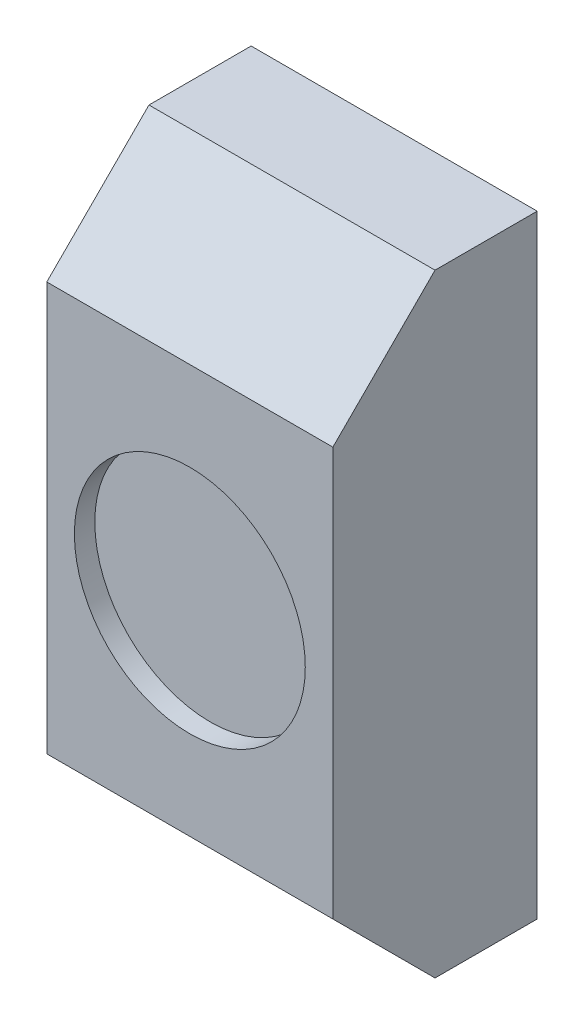
ISO-10303-21;
HEADER;
FILE_DESCRIPTION(('STEP AP214'),'2;1');
FILE_NAME('part.step','',(''),(''),'','','');
FILE_SCHEMA(('AUTOMOTIVE_DESIGN { 1 0 10303 214 1 1 1 1 }'));
ENDSEC;
DATA;
#1=APPLICATION_CONTEXT('core data for automotive mechanical design processes');
#2=APPLICATION_PROTOCOL_DEFINITION('international standard','automotive_design',2000,#1);
#3=PRODUCT_CONTEXT('',#1,'mechanical');
#4=PRODUCT('Part','Part','',(#3));
#5=PRODUCT_RELATED_PRODUCT_CATEGORY('part','',(#4));
#6=PRODUCT_DEFINITION_FORMATION('','',#4);
#7=PRODUCT_DEFINITION_CONTEXT('part definition',#1,'design');
#8=PRODUCT_DEFINITION('design','',#6,#7);
#9=PRODUCT_DEFINITION_SHAPE('','',#8);
#10=(LENGTH_UNIT() NAMED_UNIT(*) SI_UNIT(.MILLI.,.METRE.));
#11=(NAMED_UNIT(*) PLANE_ANGLE_UNIT() SI_UNIT($,.RADIAN.));
#12=(NAMED_UNIT(*) SI_UNIT($,.STERADIAN.) SOLID_ANGLE_UNIT());
#13=UNCERTAINTY_MEASURE_WITH_UNIT(LENGTH_MEASURE(1.E-05),#10,'distance_accuracy_value','');
#14=(GEOMETRIC_REPRESENTATION_CONTEXT(3) GLOBAL_UNCERTAINTY_ASSIGNED_CONTEXT((#13)) GLOBAL_UNIT_ASSIGNED_CONTEXT((#10,
#11,#12)) REPRESENTATION_CONTEXT('',''));
#15=CARTESIAN_POINT('',(0.,0.,0.));
#16=DIRECTION('',(0.,0.,1.));
#17=DIRECTION('',(1.,0.,0.));
#18=AXIS2_PLACEMENT_3D('',#15,#16,#17);
#19=CARTESIAN_POINT('',(-40.1365560583595,40.2646950029348,171.5));
#20=DIRECTION('',(1.,0.,0.));
#21=DIRECTION('',(0.,1.,0.));
#22=AXIS2_PLACEMENT_3D('',#19,#20,#21);
#23=PLANE('',#22);
#24=DIRECTION('',(0.,1.,0.));
#25=VECTOR('',#24,1.);
#26=CARTESIAN_POINT('',(-40.1365560583595,0.,169.5));
#27=LINE('',#26,#25);
#28=CARTESIAN_POINT('',(-40.1365560583595,16.093122127681,169.5));
#29=VERTEX_POINT('',#28);
#30=CARTESIAN_POINT('',(-40.1365560583595,34.4362678781886,169.5));
#31=VERTEX_POINT('',#30);
#32=EDGE_CURVE('E216',#29,#31,#27,.T.);
#33=ORIENTED_EDGE('',*,*,#32,.F.);
#34=DIRECTION('',(0.,0.707106781186547,0.707106781186548));
#35=VECTOR('',#34,1.);
#36=CARTESIAN_POINT('',(-40.1365560583595,-76.7034389361595,76.7034389361593));
#37=LINE('',#36,#35);
#38=CARTESIAN_POINT('',(-40.1365560583595,12.2646950029348,165.671572875254));
#39=VERTEX_POINT('',#38);
#40=EDGE_CURVE('E61',#39,#29,#37,.T.);
#41=ORIENTED_EDGE('',*,*,#40,.F.);
#42=DIRECTION('',(0.,0.,1.));
#43=VECTOR('',#42,1.);
#44=CARTESIAN_POINT('',(-40.1365560583595,12.2646950029348,0.));
#45=LINE('',#44,#43);
#46=CARTESIAN_POINT('',(-40.1365560583595,12.2646950029348,163.5));
#47=VERTEX_POINT('',#46);
#48=EDGE_CURVE('E199',#47,#39,#45,.T.);
#49=ORIENTED_EDGE('',*,*,#48,.F.);
#50=DIRECTION('',(0.,-1.,0.));
#51=VECTOR('',#50,1.);
#52=CARTESIAN_POINT('',(-40.1365560583595,0.,163.5));
#53=LINE('',#52,#51);
#54=CARTESIAN_POINT('',(-40.1365560583595,38.2646950029348,163.5));
#55=VERTEX_POINT('',#54);
#56=EDGE_CURVE('E225',#55,#47,#53,.T.);
#57=ORIENTED_EDGE('',*,*,#56,.F.);
#58=DIRECTION('',(0.,0.,-1.));
#59=VECTOR('',#58,1.);
#60=CARTESIAN_POINT('',(-40.1365560583595,38.2646950029348,0.));
#61=LINE('',#60,#59);
#62=CARTESIAN_POINT('',(-40.1365560583595,38.2646950029348,165.671572875254));
#63=VERTEX_POINT('',#62);
#64=EDGE_CURVE('E222',#63,#55,#61,.T.);
#65=ORIENTED_EDGE('',*,*,#64,.F.);
#66=DIRECTION('',(0.,0.707106781186544,-0.707106781186551));
#67=VECTOR('',#66,1.);
#68=CARTESIAN_POINT('',(-40.1365560583596,101.968133939094,101.968133939094));
#69=LINE('',#68,#67);
#70=EDGE_CURVE('E219',#31,#63,#69,.T.);
#71=ORIENTED_EDGE('',*,*,#70,.F.);
#72=EDGE_LOOP('',(#33,#41,#49,#57,#65,#71));
#73=FACE_BOUND('',#72,.T.);
#74=DIRECTION('',(0.,-1.,0.));
#75=VECTOR('',#74,1.);
#76=CARTESIAN_POINT('',(-40.1365560583595,40.2646950029348,171.5));
#77=LINE('',#76,#75);
#78=CARTESIAN_POINT('',(-40.1365560583595,35.2646950029348,171.5));
#79=VERTEX_POINT('',#78);
#80=CARTESIAN_POINT('',(-40.1365560583595,15.2646950029348,171.5));
#81=VERTEX_POINT('',#80);
#82=EDGE_CURVE('E242',#79,#81,#77,.T.);
#83=ORIENTED_EDGE('',*,*,#82,.F.);
#84=DIRECTION('',(0.,0.707106781186545,-0.70710678118655));
#85=VECTOR('',#84,1.);
#86=CARTESIAN_POINT('',(-40.1365560583595,35.2646950029348,171.5));
#87=LINE('',#86,#85);
#88=CARTESIAN_POINT('',(-40.1365560583595,40.2646950029348,166.5));
#89=VERTEX_POINT('',#88);
#90=EDGE_CURVE('E278',#79,#89,#87,.T.);
#91=ORIENTED_EDGE('',*,*,#90,.T.);
#92=DIRECTION('',(0.,0.,-1.));
#93=VECTOR('',#92,1.);
#94=CARTESIAN_POINT('',(-40.1365560583595,40.2646950029348,171.5));
#95=LINE('',#94,#93);
#96=CARTESIAN_POINT('',(-40.1365560583595,40.2646950029348,161.5));
#97=VERTEX_POINT('',#96);
#98=EDGE_CURVE('E247',#89,#97,#95,.T.);
#99=ORIENTED_EDGE('',*,*,#98,.T.);
#100=DIRECTION('',(0.,-1.,0.));
#101=VECTOR('',#100,1.);
#102=CARTESIAN_POINT('',(-40.1365560583595,40.2646950029348,161.5));
#103=LINE('',#102,#101);
#104=CARTESIAN_POINT('',(-40.1365560583595,10.2646950029348,161.5));
#105=VERTEX_POINT('',#104);
#106=EDGE_CURVE('E232',#97,#105,#103,.T.);
#107=ORIENTED_EDGE('',*,*,#106,.T.);
#108=DIRECTION('',(0.,0.,-1.));
#109=VECTOR('',#108,1.);
#110=CARTESIAN_POINT('',(-40.1365560583595,10.2646950029348,171.5));
#111=LINE('',#110,#109);
#112=CARTESIAN_POINT('',(-40.1365560583595,10.2646950029348,166.5));
#113=VERTEX_POINT('',#112);
#114=EDGE_CURVE('E263',#113,#105,#111,.T.);
#115=ORIENTED_EDGE('',*,*,#114,.F.);
#116=DIRECTION('',(0.,0.707106781186546,0.707106781186549));
#117=VECTOR('',#116,1.);
#118=CARTESIAN_POINT('',(-40.1365560583595,15.2646950029348,171.5));
#119=LINE('',#118,#117);
#120=EDGE_CURVE('E272',#113,#81,#119,.T.);
#121=ORIENTED_EDGE('',*,*,#120,.T.);
#122=EDGE_LOOP('',(#83,#91,#99,#107,#115,#121));
#123=FACE_BOUND('',#122,.T.);
#124=ADVANCED_FACE('F37',(#73,#123),#23,.F.);
#125=CARTESIAN_POINT('',(-40.1365560583595,10.2646950029348,171.5));
#126=DIRECTION('',(0.,1.,0.));
#127=DIRECTION('',(0.,0.,1.));
#128=AXIS2_PLACEMENT_3D('',#125,#126,#127);
#129=PLANE('',#128);
#130=DIRECTION('',(0.,0.,-1.));
#131=VECTOR('',#130,1.);
#132=CARTESIAN_POINT('',(-26.1365560583595,10.2646950029348,171.5));
#133=LINE('',#132,#131);
#134=CARTESIAN_POINT('',(-26.1365560583595,10.2646950029348,166.5));
#135=VERTEX_POINT('',#134);
#136=CARTESIAN_POINT('',(-26.1365560583595,10.2646950029348,161.5));
#137=VERTEX_POINT('',#136);
#138=EDGE_CURVE('E261',#135,#137,#133,.T.);
#139=ORIENTED_EDGE('',*,*,#138,.F.);
#140=DIRECTION('',(-1.,0.,0.));
#141=VECTOR('',#140,1.);
#142=CARTESIAN_POINT('',(-40.1365560583595,10.2646950029348,166.5));
#143=LINE('',#142,#141);
#144=EDGE_CURVE('E270',#135,#113,#143,.T.);
#145=ORIENTED_EDGE('',*,*,#144,.T.);
#146=ORIENTED_EDGE('',*,*,#114,.T.);
#147=DIRECTION('',(1.,0.,0.));
#148=VECTOR('',#147,1.);
#149=CARTESIAN_POINT('',(-40.1365560583595,10.2646950029348,161.5));
#150=LINE('',#149,#148);
#151=EDGE_CURVE('E250',#105,#137,#150,.T.);
#152=ORIENTED_EDGE('',*,*,#151,.T.);
#153=EDGE_LOOP('',(#139,#145,#146,#152));
#154=FACE_BOUND('',#153,.T.);
#155=ADVANCED_FACE('F305',(#154),#129,.F.);
#156=CARTESIAN_POINT('',(-26.1365560583595,40.2646950029348,171.5));
#157=DIRECTION('',(-1.,0.,0.));
#158=DIRECTION('',(0.,0.,1.));
#159=AXIS2_PLACEMENT_3D('',#156,#157,#158);
#160=PLANE('',#159);
#161=DIRECTION('',(0.,-0.707106781186545,0.70710678118655));
#162=VECTOR('',#161,1.);
#163=CARTESIAN_POINT('',(-26.1365560583595,35.2646950029348,171.5));
#164=LINE('',#163,#162);
#165=CARTESIAN_POINT('',(-26.1365560583595,40.2646950029348,166.5));
#166=VERTEX_POINT('',#165);
#167=CARTESIAN_POINT('',(-26.1365560583595,35.2646950029348,171.5));
#168=VERTEX_POINT('',#167);
#169=EDGE_CURVE('E11',#166,#168,#164,.T.);
#170=ORIENTED_EDGE('',*,*,#169,.T.);
#171=DIRECTION('',(0.,1.,0.));
#172=VECTOR('',#171,1.);
#173=CARTESIAN_POINT('',(-26.1365560583595,22.7564500006389,171.5));
#174=LINE('',#173,#172);
#175=CARTESIAN_POINT('',(-26.1365560583595,15.2646950029348,171.5));
#176=VERTEX_POINT('',#175);
#177=EDGE_CURVE('E244',#176,#168,#174,.T.);
#178=ORIENTED_EDGE('',*,*,#177,.F.);
#179=DIRECTION('',(0.,-0.707106781186546,-0.707106781186549));
#180=VECTOR('',#179,1.);
#181=CARTESIAN_POINT('',(-26.1365560583595,15.2646950029348,171.5));
#182=LINE('',#181,#180);
#183=EDGE_CURVE('E268',#176,#135,#182,.T.);
#184=ORIENTED_EDGE('',*,*,#183,.T.);
#185=ORIENTED_EDGE('',*,*,#138,.T.);
#186=DIRECTION('',(0.,1.,0.));
#187=VECTOR('',#186,1.);
#188=CARTESIAN_POINT('',(-26.1365560583595,40.2646950029348,161.5));
#189=LINE('',#188,#187);
#190=CARTESIAN_POINT('',(-26.1365560583595,40.2646950029348,161.5));
#191=VERTEX_POINT('',#190);
#192=EDGE_CURVE('E253',#137,#191,#189,.T.);
#193=ORIENTED_EDGE('',*,*,#192,.T.);
#194=DIRECTION('',(0.,0.,-1.));
#195=VECTOR('',#194,1.);
#196=CARTESIAN_POINT('',(-26.1365560583595,40.2646950029348,171.5));
#197=LINE('',#196,#195);
#198=EDGE_CURVE('E259',#166,#191,#197,.T.);
#199=ORIENTED_EDGE('',*,*,#198,.F.);
#200=EDGE_LOOP('',(#170,#178,#184,#185,#193,#199));
#201=FACE_BOUND('',#200,.T.);
#202=ADVANCED_FACE('F287',(#201),#160,.F.);
#203=CARTESIAN_POINT('',(-40.1365560583595,40.2646950029348,171.5));
#204=DIRECTION('',(0.,-1.,0.));
#205=DIRECTION('',(1.,0.,0.));
#206=AXIS2_PLACEMENT_3D('',#203,#204,#205);
#207=PLANE('',#206);
#208=ORIENTED_EDGE('',*,*,#98,.F.);
#209=DIRECTION('',(1.,0.,0.));
#210=VECTOR('',#209,1.);
#211=CARTESIAN_POINT('',(-26.1365560583595,40.2646950029348,166.5));
#212=LINE('',#211,#210);
#213=EDGE_CURVE('E46',#89,#166,#212,.T.);
#214=ORIENTED_EDGE('',*,*,#213,.T.);
#215=ORIENTED_EDGE('',*,*,#198,.T.);
#216=DIRECTION('',(-1.,0.,0.));
#217=VECTOR('',#216,1.);
#218=CARTESIAN_POINT('',(-40.1365560583595,40.2646950029348,161.5));
#219=LINE('',#218,#217);
#220=EDGE_CURVE('E245',#191,#97,#219,.T.);
#221=ORIENTED_EDGE('',*,*,#220,.T.);
#222=EDGE_LOOP('',(#208,#214,#215,#221));
#223=FACE_BOUND('',#222,.T.);
#224=ADVANCED_FACE('F283',(#223),#207,.F.);
#225=CARTESIAN_POINT('',(0.,0.,171.5));
#226=DIRECTION('',(0.,0.,1.));
#227=DIRECTION('',(1.,0.,0.));
#228=AXIS2_PLACEMENT_3D('',#225,#226,#227);
#229=PLANE('',#228);
#230=ORIENTED_EDGE('',*,*,#177,.T.);
#231=DIRECTION('',(-1.,0.,0.));
#232=VECTOR('',#231,1.);
#233=CARTESIAN_POINT('',(-40.1365560583595,35.2646950029348,171.5));
#234=LINE('',#233,#232);
#235=EDGE_CURVE('E275',#168,#79,#234,.T.);
#236=ORIENTED_EDGE('',*,*,#235,.T.);
#237=ORIENTED_EDGE('',*,*,#82,.T.);
#238=DIRECTION('',(1.,0.,0.));
#239=VECTOR('',#238,1.);
#240=CARTESIAN_POINT('',(-26.1365560583595,15.2646950029348,171.5));
#241=LINE('',#240,#239);
#242=EDGE_CURVE('E265',#81,#176,#241,.T.);
#243=ORIENTED_EDGE('',*,*,#242,.T.);
#244=EDGE_LOOP('',(#230,#236,#237,#243));
#245=FACE_BOUND('',#244,.T.);
#246=CARTESIAN_POINT('',(-33.1365560583595,25.2646950029348,171.5));
#247=DIRECTION('',(0.,0.,1.));
#248=DIRECTION('',(1.,0.,0.));
#249=AXIS2_PLACEMENT_3D('',#246,#247,#248);
#250=CIRCLE('',#249,5.65);
#251=CARTESIAN_POINT('',(-27.4865560583595,25.2646950029348,171.5));
#252=VERTEX_POINT('',#251);
#253=EDGE_CURVE('E186',#252,#252,#250,.T.);
#254=ORIENTED_EDGE('',*,*,#253,.F.);
#255=EDGE_LOOP('',(#254));
#256=FACE_BOUND('',#255,.T.);
#257=ADVANCED_FACE('F294',(#245,#256),#229,.T.);
#258=CARTESIAN_POINT('',(0.,0.,161.5));
#259=DIRECTION('',(0.,0.,1.));
#260=DIRECTION('',(1.,0.,0.));
#261=AXIS2_PLACEMENT_3D('',#258,#259,#260);
#262=PLANE('',#261);
#263=DIRECTION('',(1.,0.,0.));
#264=VECTOR('',#263,1.);
#265=CARTESIAN_POINT('',(-34.5822827798661,36.5286103961495,161.5));
#266=LINE('',#265,#264);
#267=CARTESIAN_POINT('',(-34.5822827798661,36.5286103961495,161.5));
#268=VERTEX_POINT('',#267);
#269=CARTESIAN_POINT('',(-31.2247695376579,36.5286103961495,161.5));
#270=VERTEX_POINT('',#269);
#271=EDGE_CURVE('E180',#268,#270,#266,.T.);
#272=ORIENTED_EDGE('',*,*,#271,.F.);
#273=DIRECTION('',(0.,1.,0.));
#274=VECTOR('',#273,1.);
#275=CARTESIAN_POINT('',(-34.5822827798661,36.5286103961495,161.5));
#276=LINE('',#275,#274);
#277=CARTESIAN_POINT('',(-34.5822827798661,13.6758589733774,161.5));
#278=VERTEX_POINT('',#277);
#279=EDGE_CURVE('E53',#278,#268,#276,.T.);
#280=ORIENTED_EDGE('',*,*,#279,.F.);
#281=DIRECTION('',(-1.,0.,0.));
#282=VECTOR('',#281,1.);
#283=CARTESIAN_POINT('',(-34.5822827798661,13.6758589733774,161.5));
#284=LINE('',#283,#282);
#285=CARTESIAN_POINT('',(-31.2247695376579,13.6758589733774,161.5));
#286=VERTEX_POINT('',#285);
#287=EDGE_CURVE('E171',#286,#278,#284,.T.);
#288=ORIENTED_EDGE('',*,*,#287,.F.);
#289=DIRECTION('',(0.,-1.,0.));
#290=VECTOR('',#289,1.);
#291=CARTESIAN_POINT('',(-31.2247695376579,36.5286103961495,161.5));
#292=LINE('',#291,#290);
#293=EDGE_CURVE('E174',#270,#286,#292,.T.);
#294=ORIENTED_EDGE('',*,*,#293,.F.);
#295=EDGE_LOOP('',(#272,#280,#288,#294));
#296=FACE_BOUND('',#295,.T.);
#297=ORIENTED_EDGE('',*,*,#192,.F.);
#298=ORIENTED_EDGE('',*,*,#151,.F.);
#299=ORIENTED_EDGE('',*,*,#106,.F.);
#300=ORIENTED_EDGE('',*,*,#220,.F.);
#301=EDGE_LOOP('',(#297,#298,#299,#300));
#302=FACE_BOUND('',#301,.T.);
#303=ADVANCED_FACE('F309',(#296,#302),#262,.F.);
#304=CARTESIAN_POINT('',(0.,15.2646950029348,171.5));
#305=DIRECTION('',(0.,-0.707106781186549,0.707106781186545));
#306=DIRECTION('',(-1.,0.,0.));
#307=AXIS2_PLACEMENT_3D('',#304,#305,#306);
#308=PLANE('',#307);
#309=ORIENTED_EDGE('',*,*,#120,.F.);
#310=ORIENTED_EDGE('',*,*,#144,.F.);
#311=ORIENTED_EDGE('',*,*,#183,.F.);
#312=ORIENTED_EDGE('',*,*,#242,.F.);
#313=EDGE_LOOP('',(#309,#310,#311,#312));
#314=FACE_BOUND('',#313,.T.);
#315=ADVANCED_FACE('F302',(#314),#308,.T.);
#316=CARTESIAN_POINT('',(0.,35.2646950029348,171.5));
#317=DIRECTION('',(0.,0.70710678118655,0.707106781186545));
#318=DIRECTION('',(1.,0.,0.));
#319=AXIS2_PLACEMENT_3D('',#316,#317,#318);
#320=PLANE('',#319);
#321=ORIENTED_EDGE('',*,*,#169,.F.);
#322=ORIENTED_EDGE('',*,*,#213,.F.);
#323=ORIENTED_EDGE('',*,*,#90,.F.);
#324=ORIENTED_EDGE('',*,*,#235,.F.);
#325=EDGE_LOOP('',(#321,#322,#323,#324));
#326=FACE_BOUND('',#325,.T.);
#327=ADVANCED_FACE('F40',(#326),#320,.T.);
#328=CARTESIAN_POINT('',(-39.1365560583595,-76.7034389361595,76.7034389361593));
#329=DIRECTION('',(0.,-0.707106781186548,0.707106781186547));
#330=DIRECTION('',(0.,-0.707106781186547,-0.707106781186548));
#331=AXIS2_PLACEMENT_3D('',#328,#329,#330);
#332=PLANE('',#331);
#333=ORIENTED_EDGE('',*,*,#40,.T.);
#334=DIRECTION('',(-1.,0.,0.));
#335=VECTOR('',#334,1.);
#336=CARTESIAN_POINT('',(-39.1365560583595,16.093122127681,169.5));
#337=LINE('',#336,#335);
#338=CARTESIAN_POINT('',(-39.1365560583595,16.093122127681,169.5));
#339=VERTEX_POINT('',#338);
#340=EDGE_CURVE('E214',#339,#29,#337,.T.);
#341=ORIENTED_EDGE('',*,*,#340,.F.);
#342=DIRECTION('',(0.,0.707106781186547,0.707106781186548));
#343=VECTOR('',#342,1.);
#344=CARTESIAN_POINT('',(-39.1365560583595,-76.7034389361595,76.7034389361593));
#345=LINE('',#344,#343);
#346=CARTESIAN_POINT('',(-39.1365560583595,12.2646950029348,165.671572875254));
#347=VERTEX_POINT('',#346);
#348=EDGE_CURVE('E195',#347,#339,#345,.T.);
#349=ORIENTED_EDGE('',*,*,#348,.F.);
#350=DIRECTION('',(-1.,0.,0.));
#351=VECTOR('',#350,1.);
#352=CARTESIAN_POINT('',(-39.1365560583595,12.2646950029348,165.671572875254));
#353=LINE('',#352,#351);
#354=EDGE_CURVE('E230',#347,#39,#353,.T.);
#355=ORIENTED_EDGE('',*,*,#354,.T.);
#356=EDGE_LOOP('',(#333,#341,#349,#355));
#357=FACE_BOUND('',#356,.T.);
#358=ADVANCED_FACE('F484',(#357),#332,.F.);
#359=CARTESIAN_POINT('',(-39.1365560583595,12.2646950029348,0.));
#360=DIRECTION('',(0.,-1.,0.));
#361=DIRECTION('',(1.,0.,0.));
#362=AXIS2_PLACEMENT_3D('',#359,#360,#361);
#363=PLANE('',#362);
#364=ORIENTED_EDGE('',*,*,#48,.T.);
#365=ORIENTED_EDGE('',*,*,#354,.F.);
#366=DIRECTION('',(0.,0.,1.));
#367=VECTOR('',#366,1.);
#368=CARTESIAN_POINT('',(-39.1365560583595,12.2646950029348,0.));
#369=LINE('',#368,#367);
#370=CARTESIAN_POINT('',(-39.1365560583595,12.2646950029348,163.5));
#371=VERTEX_POINT('',#370);
#372=EDGE_CURVE('E211',#371,#347,#369,.T.);
#373=ORIENTED_EDGE('',*,*,#372,.F.);
#374=DIRECTION('',(-1.,0.,0.));
#375=VECTOR('',#374,1.);
#376=CARTESIAN_POINT('',(-39.1365560583595,12.2646950029348,163.5));
#377=LINE('',#376,#375);
#378=EDGE_CURVE('E233',#371,#47,#377,.T.);
#379=ORIENTED_EDGE('',*,*,#378,.T.);
#380=EDGE_LOOP('',(#364,#365,#373,#379));
#381=FACE_BOUND('',#380,.T.);
#382=ADVANCED_FACE('F474',(#381),#363,.F.);
#383=CARTESIAN_POINT('',(-39.1365560583595,0.,163.5));
#384=DIRECTION('',(0.,0.,-1.));
#385=DIRECTION('',(-1.,0.,0.));
#386=AXIS2_PLACEMENT_3D('',#383,#384,#385);
#387=PLANE('',#386);
#388=ORIENTED_EDGE('',*,*,#56,.T.);
#389=ORIENTED_EDGE('',*,*,#378,.F.);
#390=DIRECTION('',(0.,-1.,0.));
#391=VECTOR('',#390,1.);
#392=CARTESIAN_POINT('',(-39.1365560583595,0.,163.5));
#393=LINE('',#392,#391);
#394=CARTESIAN_POINT('',(-39.1365560583595,38.2646950029348,163.5));
#395=VERTEX_POINT('',#394);
#396=EDGE_CURVE('E208',#395,#371,#393,.T.);
#397=ORIENTED_EDGE('',*,*,#396,.F.);
#398=DIRECTION('',(-1.,0.,0.));
#399=VECTOR('',#398,1.);
#400=CARTESIAN_POINT('',(-39.1365560583595,38.2646950029348,163.5));
#401=LINE('',#400,#399);
#402=EDGE_CURVE('E235',#395,#55,#401,.T.);
#403=ORIENTED_EDGE('',*,*,#402,.T.);
#404=EDGE_LOOP('',(#388,#389,#397,#403));
#405=FACE_BOUND('',#404,.T.);
#406=ADVANCED_FACE('F464',(#405),#387,.F.);
#407=CARTESIAN_POINT('',(-39.1365560583595,38.2646950029348,0.));
#408=DIRECTION('',(0.,1.,0.));
#409=DIRECTION('',(-1.,0.,0.));
#410=AXIS2_PLACEMENT_3D('',#407,#408,#409);
#411=PLANE('',#410);
#412=ORIENTED_EDGE('',*,*,#64,.T.);
#413=ORIENTED_EDGE('',*,*,#402,.F.);
#414=DIRECTION('',(0.,0.,-1.));
#415=VECTOR('',#414,1.);
#416=CARTESIAN_POINT('',(-39.1365560583595,38.2646950029348,0.));
#417=LINE('',#416,#415);
#418=CARTESIAN_POINT('',(-39.1365560583595,38.2646950029348,165.671572875254));
#419=VERTEX_POINT('',#418);
#420=EDGE_CURVE('E205',#419,#395,#417,.T.);
#421=ORIENTED_EDGE('',*,*,#420,.F.);
#422=DIRECTION('',(-1.,0.,0.));
#423=VECTOR('',#422,1.);
#424=CARTESIAN_POINT('',(-39.1365560583595,38.2646950029348,165.671572875254));
#425=LINE('',#424,#423);
#426=EDGE_CURVE('E237',#419,#63,#425,.T.);
#427=ORIENTED_EDGE('',*,*,#426,.T.);
#428=EDGE_LOOP('',(#412,#413,#421,#427));
#429=FACE_BOUND('',#428,.T.);
#430=ADVANCED_FACE('F454',(#429),#411,.F.);
#431=CARTESIAN_POINT('',(-39.1365560583596,101.968133939094,101.968133939094));
#432=DIRECTION('',(0.,0.707106781186551,0.707106781186544));
#433=DIRECTION('',(0.,-0.707106781186544,0.707106781186551));
#434=AXIS2_PLACEMENT_3D('',#431,#432,#433);
#435=PLANE('',#434);
#436=ORIENTED_EDGE('',*,*,#70,.T.);
#437=ORIENTED_EDGE('',*,*,#426,.F.);
#438=DIRECTION('',(0.,0.707106781186544,-0.707106781186551));
#439=VECTOR('',#438,1.);
#440=CARTESIAN_POINT('',(-39.1365560583596,101.968133939094,101.968133939094));
#441=LINE('',#440,#439);
#442=CARTESIAN_POINT('',(-39.1365560583595,34.4362678781886,169.5));
#443=VERTEX_POINT('',#442);
#444=EDGE_CURVE('E202',#443,#419,#441,.T.);
#445=ORIENTED_EDGE('',*,*,#444,.F.);
#446=DIRECTION('',(-1.,0.,0.));
#447=VECTOR('',#446,1.);
#448=CARTESIAN_POINT('',(-39.1365560583595,34.4362678781886,169.5));
#449=LINE('',#448,#447);
#450=EDGE_CURVE('E239',#443,#31,#449,.T.);
#451=ORIENTED_EDGE('',*,*,#450,.T.);
#452=EDGE_LOOP('',(#436,#437,#445,#451));
#453=FACE_BOUND('',#452,.T.);
#454=ADVANCED_FACE('F444',(#453),#435,.F.);
#455=CARTESIAN_POINT('',(-39.1365560583595,0.,169.5));
#456=DIRECTION('',(0.,0.,1.));
#457=DIRECTION('',(1.,0.,0.));
#458=AXIS2_PLACEMENT_3D('',#455,#456,#457);
#459=PLANE('',#458);
#460=ORIENTED_EDGE('',*,*,#32,.T.);
#461=ORIENTED_EDGE('',*,*,#450,.F.);
#462=DIRECTION('',(0.,1.,0.));
#463=VECTOR('',#462,1.);
#464=CARTESIAN_POINT('',(-39.1365560583595,0.,169.5));
#465=LINE('',#464,#463);
#466=EDGE_CURVE('E198',#339,#443,#465,.T.);
#467=ORIENTED_EDGE('',*,*,#466,.F.);
#468=ORIENTED_EDGE('',*,*,#340,.T.);
#469=EDGE_LOOP('',(#460,#461,#467,#468));
#470=FACE_BOUND('',#469,.T.);
#471=ADVANCED_FACE('F433',(#470),#459,.F.);
#472=CARTESIAN_POINT('',(-39.1365560583595,0.,0.));
#473=DIRECTION('',(-1.,0.,0.));
#474=DIRECTION('',(0.,-1.,0.));
#475=AXIS2_PLACEMENT_3D('',#472,#473,#474);
#476=PLANE('',#475);
#477=ORIENTED_EDGE('',*,*,#348,.T.);
#478=ORIENTED_EDGE('',*,*,#466,.T.);
#479=ORIENTED_EDGE('',*,*,#444,.T.);
#480=ORIENTED_EDGE('',*,*,#420,.T.);
#481=ORIENTED_EDGE('',*,*,#396,.T.);
#482=ORIENTED_EDGE('',*,*,#372,.T.);
#483=EDGE_LOOP('',(#477,#478,#479,#480,#481,#482));
#484=FACE_BOUND('',#483,.T.);
#485=ADVANCED_FACE('F423',(#484),#476,.T.);
#486=CARTESIAN_POINT('',(-33.1365560583595,25.2646950029348,170.5));
#487=DIRECTION('',(0.,0.,1.));
#488=DIRECTION('',(1.,0.,0.));
#489=AXIS2_PLACEMENT_3D('',#486,#487,#488);
#490=CYLINDRICAL_SURFACE('',#489,5.65);
#491=CARTESIAN_POINT('',(-33.1365560583595,25.2646950029348,170.5));
#492=DIRECTION('',(0.,0.,1.));
#493=DIRECTION('',(1.,0.,0.));
#494=AXIS2_PLACEMENT_3D('',#491,#492,#493);
#495=CIRCLE('',#494,5.65);
#496=CARTESIAN_POINT('',(-27.4865560583595,25.2646950029348,170.5));
#497=VERTEX_POINT('',#496);
#498=EDGE_CURVE('E190',#497,#497,#495,.T.);
#499=ORIENTED_EDGE('',*,*,#498,.F.);
#500=EDGE_LOOP('',(#499));
#501=FACE_BOUND('',#500,.T.);
#502=ORIENTED_EDGE('',*,*,#253,.T.);
#503=EDGE_LOOP('',(#502));
#504=FACE_BOUND('',#503,.T.);
#505=ADVANCED_FACE('F414',(#501,#504),#490,.F.);
#506=CARTESIAN_POINT('',(-33.1365560583595,25.2646950029348,170.5));
#507=DIRECTION('',(0.,0.,1.));
#508=DIRECTION('',(1.,0.,0.));
#509=AXIS2_PLACEMENT_3D('',#506,#507,#508);
#510=PLANE('',#509);
#511=ORIENTED_EDGE('',*,*,#498,.T.);
#512=EDGE_LOOP('',(#511));
#513=FACE_BOUND('',#512,.T.);
#514=ADVANCED_FACE('F398',(#513),#510,.T.);
#515=CARTESIAN_POINT('',(-34.5822827798661,36.5286103961495,162.));
#516=DIRECTION('',(-1.,0.,0.));
#517=DIRECTION('',(0.,0.,1.));
#518=AXIS2_PLACEMENT_3D('',#515,#516,#517);
#519=PLANE('',#518);
#520=ORIENTED_EDGE('',*,*,#279,.T.);
#521=DIRECTION('',(0.,0.,-1.));
#522=VECTOR('',#521,1.);
#523=CARTESIAN_POINT('',(-34.5822827798661,36.5286103961495,162.));
#524=LINE('',#523,#522);
#525=CARTESIAN_POINT('',(-34.5822827798661,36.5286103961495,162.));
#526=VERTEX_POINT('',#525);
#527=EDGE_CURVE('E149',#526,#268,#524,.T.);
#528=ORIENTED_EDGE('',*,*,#527,.F.);
#529=DIRECTION('',(0.,1.,0.));
#530=VECTOR('',#529,1.);
#531=CARTESIAN_POINT('',(-34.5822827798661,36.5286103961495,162.));
#532=LINE('',#531,#530);
#533=CARTESIAN_POINT('',(-34.5822827798661,13.6758589733774,162.));
#534=VERTEX_POINT('',#533);
#535=EDGE_CURVE('E153',#534,#526,#532,.T.);
#536=ORIENTED_EDGE('',*,*,#535,.F.);
#537=DIRECTION('',(0.,0.,-1.));
#538=VECTOR('',#537,1.);
#539=CARTESIAN_POINT('',(-34.5822827798661,13.6758589733774,162.));
#540=LINE('',#539,#538);
#541=EDGE_CURVE('E184',#534,#278,#540,.T.);
#542=ORIENTED_EDGE('',*,*,#541,.T.);
#543=EDGE_LOOP('',(#520,#528,#536,#542));
#544=FACE_BOUND('',#543,.T.);
#545=ADVANCED_FACE('F151',(#544),#519,.F.);
#546=CARTESIAN_POINT('',(-34.5822827798661,13.6758589733774,162.));
#547=DIRECTION('',(0.,-1.,0.));
#548=DIRECTION('',(0.,0.,-1.));
#549=AXIS2_PLACEMENT_3D('',#546,#547,#548);
#550=PLANE('',#549);
#551=ORIENTED_EDGE('',*,*,#287,.T.);
#552=ORIENTED_EDGE('',*,*,#541,.F.);
#553=DIRECTION('',(-1.,0.,0.));
#554=VECTOR('',#553,1.);
#555=CARTESIAN_POINT('',(-34.5822827798661,13.6758589733774,162.));
#556=LINE('',#555,#554);
#557=CARTESIAN_POINT('',(-31.2247695376579,13.6758589733774,162.));
#558=VERTEX_POINT('',#557);
#559=EDGE_CURVE('E159',#558,#534,#556,.T.);
#560=ORIENTED_EDGE('',*,*,#559,.F.);
#561=DIRECTION('',(0.,0.,-1.));
#562=VECTOR('',#561,1.);
#563=CARTESIAN_POINT('',(-31.2247695376579,13.6758589733774,162.));
#564=LINE('',#563,#562);
#565=EDGE_CURVE('E187',#558,#286,#564,.T.);
#566=ORIENTED_EDGE('',*,*,#565,.T.);
#567=EDGE_LOOP('',(#551,#552,#560,#566));
#568=FACE_BOUND('',#567,.T.);
#569=ADVANCED_FACE('F380',(#568),#550,.F.);
#570=CARTESIAN_POINT('',(-31.2247695376579,36.5286103961495,162.));
#571=DIRECTION('',(1.,0.,0.));
#572=DIRECTION('',(0.,0.,-1.));
#573=AXIS2_PLACEMENT_3D('',#570,#571,#572);
#574=PLANE('',#573);
#575=ORIENTED_EDGE('',*,*,#293,.T.);
#576=ORIENTED_EDGE('',*,*,#565,.F.);
#577=DIRECTION('',(0.,-1.,0.));
#578=VECTOR('',#577,1.);
#579=CARTESIAN_POINT('',(-31.2247695376579,36.5286103961495,162.));
#580=LINE('',#579,#578);
#581=CARTESIAN_POINT('',(-31.2247695376579,36.5286103961495,162.));
#582=VERTEX_POINT('',#581);
#583=EDGE_CURVE('E167',#582,#558,#580,.T.);
#584=ORIENTED_EDGE('',*,*,#583,.F.);
#585=DIRECTION('',(0.,0.,-1.));
#586=VECTOR('',#585,1.);
#587=CARTESIAN_POINT('',(-31.2247695376579,36.5286103961495,162.));
#588=LINE('',#587,#586);
#589=EDGE_CURVE('E158',#582,#270,#588,.T.);
#590=ORIENTED_EDGE('',*,*,#589,.T.);
#591=EDGE_LOOP('',(#575,#576,#584,#590));
#592=FACE_BOUND('',#591,.T.);
#593=ADVANCED_FACE('F371',(#592),#574,.F.);
#594=CARTESIAN_POINT('',(-34.5822827798661,36.5286103961495,162.));
#595=DIRECTION('',(0.,1.,0.));
#596=DIRECTION('',(0.,0.,1.));
#597=AXIS2_PLACEMENT_3D('',#594,#595,#596);
#598=PLANE('',#597);
#599=ORIENTED_EDGE('',*,*,#271,.T.);
#600=ORIENTED_EDGE('',*,*,#589,.F.);
#601=DIRECTION('',(1.,0.,0.));
#602=VECTOR('',#601,1.);
#603=CARTESIAN_POINT('',(-34.5822827798661,36.5286103961495,162.));
#604=LINE('',#603,#602);
#605=EDGE_CURVE('E162',#526,#582,#604,.T.);
#606=ORIENTED_EDGE('',*,*,#605,.F.);
#607=ORIENTED_EDGE('',*,*,#527,.T.);
#608=EDGE_LOOP('',(#599,#600,#606,#607));
#609=FACE_BOUND('',#608,.T.);
#610=ADVANCED_FACE('F163',(#609),#598,.F.);
#611=CARTESIAN_POINT('',(0.,0.,162.));
#612=DIRECTION('',(0.,0.,1.));
#613=DIRECTION('',(1.,0.,0.));
#614=AXIS2_PLACEMENT_3D('',#611,#612,#613);
#615=PLANE('',#614);
#616=ORIENTED_EDGE('',*,*,#535,.T.);
#617=ORIENTED_EDGE('',*,*,#605,.T.);
#618=ORIENTED_EDGE('',*,*,#583,.T.);
#619=ORIENTED_EDGE('',*,*,#559,.T.);
#620=EDGE_LOOP('',(#616,#617,#618,#619));
#621=FACE_BOUND('',#620,.T.);
#622=ADVANCED_FACE('F169',(#621),#615,.F.);
#623=CLOSED_SHELL('',(#124,#155,#202,#224,#257,#303,#315,#327,#358,#382,#406,#430,#454,#471,
#485,#505,#514,#545,#569,#593,#610,#622));
#624=MANIFOLD_SOLID_BREP('B2',#623);
#625=ADVANCED_BREP_SHAPE_REPRESENTATION('',(#18,#624),#14);
#626=SHAPE_DEFINITION_REPRESENTATION(#9,#625);
ENDSEC;
END-ISO-10303-21;
